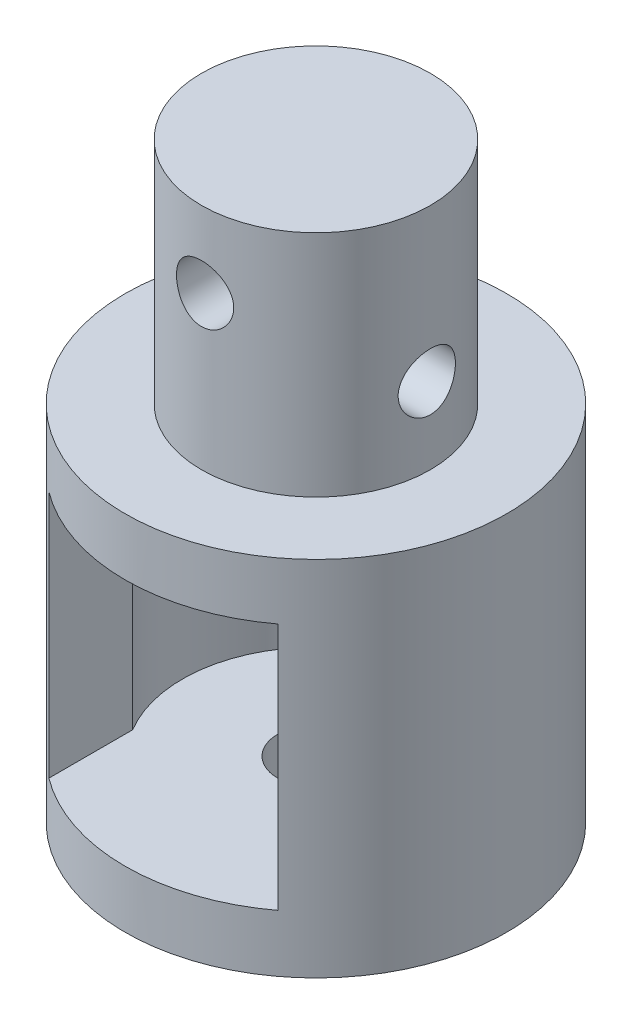
ISO-10303-21;
HEADER;
FILE_DESCRIPTION(('STEP AP214'),'2;1');
FILE_NAME('part.step','',(''),(''),'','','');
FILE_SCHEMA(('AUTOMOTIVE_DESIGN { 1 0 10303 214 1 1 1 1 }'));
ENDSEC;
DATA;
#1=APPLICATION_CONTEXT('core data for automotive mechanical design processes');
#2=APPLICATION_PROTOCOL_DEFINITION('international standard','automotive_design',2000,#1);
#3=PRODUCT_CONTEXT('',#1,'mechanical');
#4=PRODUCT('Part','Part','',(#3));
#5=PRODUCT_RELATED_PRODUCT_CATEGORY('part','',(#4));
#6=PRODUCT_DEFINITION_FORMATION('','',#4);
#7=PRODUCT_DEFINITION_CONTEXT('part definition',#1,'design');
#8=PRODUCT_DEFINITION('design','',#6,#7);
#9=PRODUCT_DEFINITION_SHAPE('','',#8);
#10=(LENGTH_UNIT() NAMED_UNIT(*) SI_UNIT(.MILLI.,.METRE.));
#11=(NAMED_UNIT(*) PLANE_ANGLE_UNIT() SI_UNIT($,.RADIAN.));
#12=(NAMED_UNIT(*) SI_UNIT($,.STERADIAN.) SOLID_ANGLE_UNIT());
#13=UNCERTAINTY_MEASURE_WITH_UNIT(LENGTH_MEASURE(1.E-05),#10,'distance_accuracy_value','');
#14=(GEOMETRIC_REPRESENTATION_CONTEXT(3) GLOBAL_UNCERTAINTY_ASSIGNED_CONTEXT((#13)) GLOBAL_UNIT_ASSIGNED_CONTEXT((#10,
#11,#12)) REPRESENTATION_CONTEXT('',''));
#15=CARTESIAN_POINT('',(0.,0.,0.));
#16=DIRECTION('',(0.,0.,1.));
#17=DIRECTION('',(1.,0.,0.));
#18=AXIS2_PLACEMENT_3D('',#15,#16,#17);
#19=CARTESIAN_POINT('',(0.,16.,0.));
#20=DIRECTION('',(0.,-1.,0.));
#21=DIRECTION('',(0.,0.,-1.));
#22=AXIS2_PLACEMENT_3D('',#19,#20,#21);
#23=CYLINDRICAL_SURFACE('',#22,7.);
#24=CARTESIAN_POINT('',(0.,3.,0.));
#25=DIRECTION('',(0.,1.,0.));
#26=DIRECTION('',(0.,0.,1.));
#27=AXIS2_PLACEMENT_3D('',#24,#25,#26);
#28=CIRCLE('',#27,7.);
#29=CARTESIAN_POINT('',(6.,3.,3.60555127546399));
#30=VERTEX_POINT('',#29);
#31=CARTESIAN_POINT('',(-6.,3.,3.60555127546399));
#32=VERTEX_POINT('',#31);
#33=EDGE_CURVE('E99',#30,#32,#28,.T.);
#34=ORIENTED_EDGE('',*,*,#33,.F.);
#35=DIRECTION('',(0.,-1.,0.));
#36=VECTOR('',#35,1.);
#37=CARTESIAN_POINT('',(6.,16.,3.60555127546399));
#38=LINE('',#37,#36);
#39=CARTESIAN_POINT('',(6.,16.,3.60555127546399));
#40=VERTEX_POINT('',#39);
#41=EDGE_CURVE('E89',#30,#40,#38,.F.);
#42=ORIENTED_EDGE('',*,*,#41,.T.);
#43=CARTESIAN_POINT('',(0.,16.,0.));
#44=DIRECTION('',(0.,1.,0.));
#45=DIRECTION('',(0.,0.,1.));
#46=AXIS2_PLACEMENT_3D('',#43,#44,#45);
#47=CIRCLE('',#46,7.);
#48=CARTESIAN_POINT('',(-6.,16.,3.60555127546399));
#49=VERTEX_POINT('',#48);
#50=EDGE_CURVE('E107',#40,#49,#47,.T.);
#51=ORIENTED_EDGE('',*,*,#50,.T.);
#52=DIRECTION('',(0.,-1.,0.));
#53=VECTOR('',#52,1.);
#54=CARTESIAN_POINT('',(-6.,16.,3.60555127546399));
#55=LINE('',#54,#53);
#56=EDGE_CURVE('E90',#49,#32,#55,.T.);
#57=ORIENTED_EDGE('',*,*,#56,.T.);
#58=EDGE_LOOP('',(#34,#42,#51,#57));
#59=FACE_BOUND('',#58,.T.);
#60=ADVANCED_FACE('F39',(#59),#23,.F.);
#61=CARTESIAN_POINT('',(0.,16.,0.));
#62=DIRECTION('',(0.,1.,0.));
#63=DIRECTION('',(0.,0.,1.));
#64=AXIS2_PLACEMENT_3D('',#61,#62,#63);
#65=PLANE('',#64);
#66=ORIENTED_EDGE('',*,*,#50,.F.);
#67=DIRECTION('',(0.,0.,-1.));
#68=VECTOR('',#67,1.);
#69=CARTESIAN_POINT('',(6.,16.,18.));
#70=LINE('',#69,#68);
#71=CARTESIAN_POINT('',(6.,16.,8.));
#72=VERTEX_POINT('',#71);
#73=EDGE_CURVE('E198',#72,#40,#70,.T.);
#74=ORIENTED_EDGE('',*,*,#73,.F.);
#75=CARTESIAN_POINT('',(0.,16.,0.));
#76=DIRECTION('',(0.,-1.,0.));
#77=DIRECTION('',(0.,0.,-1.));
#78=AXIS2_PLACEMENT_3D('',#75,#76,#77);
#79=CIRCLE('',#78,10.);
#80=CARTESIAN_POINT('',(-6.,16.,8.));
#81=VERTEX_POINT('',#80);
#82=EDGE_CURVE('E105',#72,#81,#79,.T.);
#83=ORIENTED_EDGE('',*,*,#82,.T.);
#84=DIRECTION('',(0.,0.,-1.));
#85=VECTOR('',#84,1.);
#86=CARTESIAN_POINT('',(-6.,16.,18.));
#87=LINE('',#86,#85);
#88=EDGE_CURVE('E61',#81,#49,#87,.T.);
#89=ORIENTED_EDGE('',*,*,#88,.T.);
#90=EDGE_LOOP('',(#66,#74,#83,#89));
#91=FACE_BOUND('',#90,.T.);
#92=ADVANCED_FACE('F152',(#91),#65,.F.);
#93=CARTESIAN_POINT('',(0.,3.,0.));
#94=DIRECTION('',(0.,1.,0.));
#95=DIRECTION('',(0.,0.,1.));
#96=AXIS2_PLACEMENT_3D('',#93,#94,#95);
#97=PLANE('',#96);
#98=CARTESIAN_POINT('',(0.,3.,0.));
#99=DIRECTION('',(0.,1.,0.));
#100=DIRECTION('',(0.,0.,1.));
#101=AXIS2_PLACEMENT_3D('',#98,#99,#100);
#102=CIRCLE('',#101,2.);
#103=CARTESIAN_POINT('',(0.,3.,2.));
#104=VERTEX_POINT('',#103);
#105=EDGE_CURVE('E129',#104,#104,#102,.T.);
#106=ORIENTED_EDGE('',*,*,#105,.F.);
#107=EDGE_LOOP('',(#106));
#108=FACE_BOUND('',#107,.T.);
#109=ORIENTED_EDGE('',*,*,#33,.T.);
#110=DIRECTION('',(0.,0.,-1.));
#111=VECTOR('',#110,1.);
#112=CARTESIAN_POINT('',(-6.,3.,18.));
#113=LINE('',#112,#111);
#114=CARTESIAN_POINT('',(-6.,3.,8.));
#115=VERTEX_POINT('',#114);
#116=EDGE_CURVE('E66',#115,#32,#113,.T.);
#117=ORIENTED_EDGE('',*,*,#116,.F.);
#118=CARTESIAN_POINT('',(0.,3.,0.));
#119=DIRECTION('',(0.,1.,0.));
#120=DIRECTION('',(0.,0.,1.));
#121=AXIS2_PLACEMENT_3D('',#118,#119,#120);
#122=CIRCLE('',#121,10.);
#123=CARTESIAN_POINT('',(6.,3.,8.));
#124=VERTEX_POINT('',#123);
#125=EDGE_CURVE('E96',#115,#124,#122,.T.);
#126=ORIENTED_EDGE('',*,*,#125,.T.);
#127=DIRECTION('',(0.,0.,-1.));
#128=VECTOR('',#127,1.);
#129=CARTESIAN_POINT('',(6.,3.,18.));
#130=LINE('',#129,#128);
#131=EDGE_CURVE('E200',#124,#30,#130,.T.);
#132=ORIENTED_EDGE('',*,*,#131,.T.);
#133=EDGE_LOOP('',(#109,#117,#126,#132));
#134=FACE_BOUND('',#133,.T.);
#135=ADVANCED_FACE('F94',(#108,#134),#97,.T.);
#136=CARTESIAN_POINT('',(6.,3.,18.));
#137=DIRECTION('',(-1.,0.,0.));
#138=DIRECTION('',(0.,0.,1.));
#139=AXIS2_PLACEMENT_3D('',#136,#137,#138);
#140=PLANE('',#139);
#141=DIRECTION('',(0.,1.,0.));
#142=VECTOR('',#141,1.);
#143=CARTESIAN_POINT('',(6.,31.,8.));
#144=LINE('',#143,#142);
#145=EDGE_CURVE('E104',#124,#72,#144,.T.);
#146=ORIENTED_EDGE('',*,*,#145,.T.);
#147=ORIENTED_EDGE('',*,*,#73,.T.);
#148=ORIENTED_EDGE('',*,*,#41,.F.);
#149=ORIENTED_EDGE('',*,*,#131,.F.);
#150=EDGE_LOOP('',(#146,#147,#148,#149));
#151=FACE_BOUND('',#150,.T.);
#152=ADVANCED_FACE('F148',(#151),#140,.T.);
#153=CARTESIAN_POINT('',(-6.,16.,18.));
#154=DIRECTION('',(1.,0.,0.));
#155=DIRECTION('',(0.,0.,-1.));
#156=AXIS2_PLACEMENT_3D('',#153,#154,#155);
#157=PLANE('',#156);
#158=DIRECTION('',(0.,1.,0.));
#159=VECTOR('',#158,1.);
#160=CARTESIAN_POINT('',(-6.,31.,8.));
#161=LINE('',#160,#159);
#162=EDGE_CURVE('E84',#81,#115,#161,.F.);
#163=ORIENTED_EDGE('',*,*,#162,.T.);
#164=ORIENTED_EDGE('',*,*,#116,.T.);
#165=ORIENTED_EDGE('',*,*,#56,.F.);
#166=ORIENTED_EDGE('',*,*,#88,.F.);
#167=EDGE_LOOP('',(#163,#164,#165,#166));
#168=FACE_BOUND('',#167,.T.);
#169=ADVANCED_FACE('F85',(#168),#157,.T.);
#170=CARTESIAN_POINT('',(0.,31.,0.));
#171=DIRECTION('',(0.,1.,0.));
#172=DIRECTION('',(-1.,0.,0.));
#173=AXIS2_PLACEMENT_3D('',#170,#171,#172);
#174=CYLINDRICAL_SURFACE('',#173,10.);
#175=CARTESIAN_POINT('',(0.,0.,0.));
#176=DIRECTION('',(0.,1.,0.));
#177=DIRECTION('',(-1.,0.,0.));
#178=AXIS2_PLACEMENT_3D('',#175,#176,#177);
#179=CIRCLE('',#178,10.);
#180=CARTESIAN_POINT('',(-10.,0.,0.));
#181=VERTEX_POINT('',#180);
#182=EDGE_CURVE('E11',#181,#181,#179,.T.);
#183=ORIENTED_EDGE('',*,*,#182,.T.);
#184=EDGE_LOOP('',(#183));
#185=FACE_BOUND('',#184,.T.);
#186=CARTESIAN_POINT('',(0.,19.,0.));
#187=DIRECTION('',(0.,1.,0.));
#188=DIRECTION('',(-1.,0.,0.));
#189=AXIS2_PLACEMENT_3D('',#186,#187,#188);
#190=CIRCLE('',#189,10.);
#191=CARTESIAN_POINT('',(-10.,19.,0.));
#192=VERTEX_POINT('',#191);
#193=EDGE_CURVE('E53',#192,#192,#190,.T.);
#194=ORIENTED_EDGE('',*,*,#193,.F.);
#195=EDGE_LOOP('',(#194));
#196=FACE_BOUND('',#195,.T.);
#197=ORIENTED_EDGE('',*,*,#125,.F.);
#198=ORIENTED_EDGE('',*,*,#162,.F.);
#199=ORIENTED_EDGE('',*,*,#82,.F.);
#200=ORIENTED_EDGE('',*,*,#145,.F.);
#201=EDGE_LOOP('',(#197,#198,#199,#200));
#202=FACE_BOUND('',#201,.T.);
#203=ADVANCED_FACE('F103',(#185,#196,#202),#174,.T.);
#204=CARTESIAN_POINT('',(0.,0.,0.));
#205=DIRECTION('',(0.,1.,0.));
#206=DIRECTION('',(-1.,0.,0.));
#207=AXIS2_PLACEMENT_3D('',#204,#205,#206);
#208=PLANE('',#207);
#209=CARTESIAN_POINT('',(0.,0.,0.));
#210=DIRECTION('',(0.,-1.,0.));
#211=DIRECTION('',(0.,0.,-1.));
#212=AXIS2_PLACEMENT_3D('',#209,#210,#211);
#213=CIRCLE('',#212,2.);
#214=CARTESIAN_POINT('',(0.,0.,-2.));
#215=VERTEX_POINT('',#214);
#216=EDGE_CURVE('E189',#215,#215,#213,.T.);
#217=ORIENTED_EDGE('',*,*,#216,.F.);
#218=EDGE_LOOP('',(#217));
#219=FACE_BOUND('',#218,.T.);
#220=ORIENTED_EDGE('',*,*,#182,.F.);
#221=EDGE_LOOP('',(#220));
#222=FACE_BOUND('',#221,.T.);
#223=ADVANCED_FACE('F41',(#219,#222),#208,.F.);
#224=CARTESIAN_POINT('',(10.,19.,0.));
#225=DIRECTION('',(0.,-1.,0.));
#226=DIRECTION('',(1.,0.,0.));
#227=AXIS2_PLACEMENT_3D('',#224,#225,#226);
#228=PLANE('',#227);
#229=CARTESIAN_POINT('',(0.,19.,0.));
#230=DIRECTION('',(0.,1.,0.));
#231=DIRECTION('',(-1.,0.,0.));
#232=AXIS2_PLACEMENT_3D('',#229,#230,#231);
#233=CIRCLE('',#232,6.);
#234=CARTESIAN_POINT('',(-6.,19.,0.));
#235=VERTEX_POINT('',#234);
#236=EDGE_CURVE('E117',#235,#235,#233,.T.);
#237=ORIENTED_EDGE('',*,*,#236,.F.);
#238=EDGE_LOOP('',(#237));
#239=FACE_BOUND('',#238,.T.);
#240=ORIENTED_EDGE('',*,*,#193,.T.);
#241=EDGE_LOOP('',(#240));
#242=FACE_BOUND('',#241,.T.);
#243=ADVANCED_FACE('F166',(#239,#242),#228,.F.);
#244=CARTESIAN_POINT('',(0.,31.,0.));
#245=DIRECTION('',(0.,1.,0.));
#246=DIRECTION('',(-1.,0.,0.));
#247=AXIS2_PLACEMENT_3D('',#244,#245,#246);
#248=CYLINDRICAL_SURFACE('',#247,6.);
#249=CARTESIAN_POINT('',(-6.,21.5,0.));
#250=CARTESIAN_POINT('',(-5.99999859868012,21.5000023257382,-0.0828760886697311));
#251=CARTESIAN_POINT('',(-5.99826578131828,21.5068915507738,-0.165778157830763));
#252=CARTESIAN_POINT('',(-5.99152113829892,21.534225151307,-0.329206323770533));
#253=CARTESIAN_POINT('',(-5.98650745419968,21.5546772095378,-0.409731046870739));
#254=CARTESIAN_POINT('',(-5.9737562633204,21.6084392534621,-0.566020872182577));
#255=CARTESIAN_POINT('',(-5.96602202842087,21.6417337987153,-0.641791563430003));
#256=CARTESIAN_POINT('',(-5.94865343807593,21.7201813900448,-0.786672131904427));
#257=CARTESIAN_POINT('',(-5.9390190185405,21.7653348361189,-0.85578178434876));
#258=CARTESIAN_POINT('',(-5.91867413591801,21.8672007896542,-0.986801927300921));
#259=CARTESIAN_POINT('',(-5.90794707148533,21.9241115749592,-1.04855569006107));
#260=CARTESIAN_POINT('',(-5.88673620117529,22.0474522049089,-1.16174892720331));
#261=CARTESIAN_POINT('',(-5.87625242288348,22.1138831229465,-1.21318723694914));
#262=CARTESIAN_POINT('',(-5.8565477569971,22.2555952267374,-1.30502654279903));
#263=CARTESIAN_POINT('',(-5.84734794470605,22.3309932308104,-1.34525221592536));
#264=CARTESIAN_POINT('',(-5.83149494812223,22.4877484116584,-1.41239690855053));
#265=CARTESIAN_POINT('',(-5.82484135672789,22.5691046333258,-1.43931805543933));
#266=CARTESIAN_POINT('',(-5.81500476717551,22.7337434982025,-1.47855483680429));
#267=CARTESIAN_POINT('',(-5.81175491075426,22.8169548960498,-1.49115226833334));
#268=CARTESIAN_POINT('',(-5.80889362537741,22.984368569014,-1.50226177506785));
#269=CARTESIAN_POINT('',(-5.80928160448644,23.0685706806986,-1.50077614181798));
#270=CARTESIAN_POINT('',(-5.81359205496618,23.2334158077445,-1.48398652463928));
#271=CARTESIAN_POINT('',(-5.81742863001879,23.3140956214651,-1.46901834019052));
#272=CARTESIAN_POINT('',(-5.82806709676483,23.4717610509113,-1.42622418690311));
#273=CARTESIAN_POINT('',(-5.83486919970696,23.548746403029,-1.39839730206942));
#274=CARTESIAN_POINT('',(-5.85075113904186,23.6977380162521,-1.33038947793716));
#275=CARTESIAN_POINT('',(-5.85985327469421,23.7696861717896,-1.29008666723291));
#276=CARTESIAN_POINT('',(-5.87929710846386,23.9059187097568,-1.19835627601496));
#277=CARTESIAN_POINT('',(-5.88963902334735,23.9702017480673,-1.14692674880884));
#278=CARTESIAN_POINT('',(-5.91075880539781,24.0912036156944,-1.03266342468122));
#279=CARTESIAN_POINT('',(-5.92154069477971,24.1476544900613,-0.969546258165861));
#280=CARTESIAN_POINT('',(-5.94205965578785,24.2492212424639,-0.834611917503702));
#281=CARTESIAN_POINT('',(-5.95179669549415,24.2943367742636,-0.762794477707947));
#282=CARTESIAN_POINT('',(-5.96917732094182,24.3720505862244,-0.612115888681395));
#283=CARTESIAN_POINT('',(-5.97681360127725,24.4046053402544,-0.533231393208626));
#284=CARTESIAN_POINT('',(-5.98907916991418,24.4559173057096,-0.370876008142885));
#285=CARTESIAN_POINT('',(-5.99370903339281,24.4746771564181,-0.287405999150486));
#286=CARTESIAN_POINT('',(-5.99935499271374,24.4974575655588,-0.120539970390027));
#287=CARTESIAN_POINT('',(-6.00046053508278,24.5018430260753,-0.0371967199882093));
#288=CARTESIAN_POINT('',(-5.99918804814451,24.4967509979445,0.129032874801509));
#289=CARTESIAN_POINT('',(-5.99681033241846,24.4872747572009,0.211919259644596));
#290=CARTESIAN_POINT('',(-5.98889581127357,24.4550290916086,0.373614268776492));
#291=CARTESIAN_POINT('',(-5.98340634185811,24.432458736523,0.452465118968754));
#292=CARTESIAN_POINT('',(-5.96988706634134,24.3748929159716,0.605257292452511));
#293=CARTESIAN_POINT('',(-5.96185700369892,24.3398961956868,0.679198119032635));
#294=CARTESIAN_POINT('',(-5.9439330792631,24.2577638711253,0.821523134429849));
#295=CARTESIAN_POINT('',(-5.93400867366932,24.2104238876032,0.889785441835833));
#296=CARTESIAN_POINT('',(-5.91344509187419,24.105210091203,1.01752661364325));
#297=CARTESIAN_POINT('',(-5.90280579251704,24.0473344603831,1.07700395897301));
#298=CARTESIAN_POINT('',(-5.88168956960771,23.9209980391555,1.18699056807273));
#299=CARTESIAN_POINT('',(-5.87122304187281,23.8523122969976,1.23724386762203));
#300=CARTESIAN_POINT('',(-5.85192878377238,23.7072673655343,1.3255107590127));
#301=CARTESIAN_POINT('',(-5.84310098067026,23.6309085170402,1.36352489415794));
#302=CARTESIAN_POINT('',(-5.82818094734665,23.4730942775869,1.42595142060929));
#303=CARTESIAN_POINT('',(-5.82207255291905,23.391672371656,1.45044439665407));
#304=CARTESIAN_POINT('',(-5.81326744090183,23.2256903621109,1.48534565995378));
#305=CARTESIAN_POINT('',(-5.81056997719936,23.1411309489675,1.49575702747866));
#306=CARTESIAN_POINT('',(-5.80894901203957,22.9738789761448,1.502038590334));
#307=CARTESIAN_POINT('',(-5.80991932728263,22.8912025648753,1.49831789778012));
#308=CARTESIAN_POINT('',(-5.81527909007842,22.727696111332,1.47737727831287));
#309=CARTESIAN_POINT('',(-5.81966846891857,22.6468660319863,1.46015762268677));
#310=CARTESIAN_POINT('',(-5.83131260682722,22.4897915409346,1.4129313194428));
#311=CARTESIAN_POINT('',(-5.83855015236309,22.4135226947598,1.38300140468038));
#312=CARTESIAN_POINT('',(-5.85507755724828,22.2670346172863,1.31126491360507));
#313=CARTESIAN_POINT('',(-5.86436770120773,22.1968162268131,1.26945669003419));
#314=CARTESIAN_POINT('',(-5.88425634263512,22.062445370998,1.17386774863714));
#315=CARTESIAN_POINT('',(-5.89488264831757,21.998498926576,1.11980316291226));
#316=CARTESIAN_POINT('',(-5.91608027246285,21.8804529552046,1.00178937118974));
#317=CARTESIAN_POINT('',(-5.92665157727059,21.826355769887,0.937837821261147));
#318=CARTESIAN_POINT('',(-5.94677655647663,21.7285886914354,0.800467586702591));
#319=CARTESIAN_POINT('',(-5.95630833365868,21.6851253863284,0.726898422316388));
#320=CARTESIAN_POINT('',(-5.97304924975118,21.6112525370595,0.573266059510477));
#321=CARTESIAN_POINT('',(-5.98026005199781,21.5808336393515,0.49320756343674));
#322=CARTESIAN_POINT('',(-5.99048059565541,21.5384281696703,0.344410253243472));
#323=CARTESIAN_POINT('',(-5.9940258505269,21.5240487569466,0.276380170908069));
#324=CARTESIAN_POINT('',(-5.99878605231948,21.5048340563781,0.138906071536283));
#325=CARTESIAN_POINT('',(-6.00000117450894,21.4999980506947,0.0694621612426163));
#326=CARTESIAN_POINT('',(-6.,21.5,0.));
#327=B_SPLINE_CURVE_WITH_KNOTS('',3,(#249,#250,#251,#252,#253,#254,#255,#256,#257,#258,#259,
#260,#261,#262,#263,#264,#265,#266,#267,#268,#269,#270,#271,#272,#273,#274,#275,#276,#277,#278,
#279,#280,#281,#282,#283,#284,#285,#286,#287,#288,#289,#290,#291,#292,#293,#294,#295,#296,#297,
#298,#299,#300,#301,#302,#303,#304,#305,#306,#307,#308,#309,#310,#311,#312,#313,#314,#315,#316,
#317,#318,#319,#320,#321,#322,#323,#324,#325,#326),.UNSPECIFIED.,.T.,.F.,(4,2,2,2,2,2,2,2,2,2,2,
2,2,2,2,2,2,2,2,2,2,2,2,2,2,2,2,2,2,2,2,2,2,2,2,2,2,2,4),(0.,0.24837371247189,0.4968882377639,
0.745104902286105,0.99332994016933,1.24614435437139,1.49898729580062,1.75558647545807,
2.01214461169369,2.26356295099431,2.51494038112697,2.76022497007018,3.00552703466039,
3.2533052787388,3.50112690836163,3.75601500969019,4.01091089558247,4.26668229009114,
4.52240473688643,4.77158308949277,5.02073901112743,5.26620274514038,5.51169127322291,
5.76153587565353,6.0114236300802,6.26744509204476,6.52345518749508,6.77792254614037,
7.03233423252408,7.27943780398613,7.52653640956035,7.77216400559448,8.01782568136901,
8.2698957640991,8.52202569770418,8.77872185499588,9.03523363821351,9.2434224294215,
9.4515955604304),.UNSPECIFIED.);
#328=CARTESIAN_POINT('',(-6.,21.5,0.));
#329=VERTEX_POINT('',#328);
#330=EDGE_CURVE('E43',#329,#329,#327,.T.);
#331=ORIENTED_EDGE('',*,*,#330,.T.);
#332=EDGE_LOOP('',(#331));
#333=FACE_BOUND('',#332,.T.);
#334=CARTESIAN_POINT('',(5.80947501931112,23.,-1.5));
#335=CARTESIAN_POINT('',(5.80947660051185,22.9171695494452,-1.49999764715507));
#336=CARTESIAN_POINT('',(5.81126583608348,22.8343130607932,-1.49311574729838));
#337=CARTESIAN_POINT('',(5.81821117195949,22.6709794530956,-1.46581387527849));
#338=CARTESIAN_POINT('',(5.82336923173088,22.590503747319,-1.44538602404532));
#339=CARTESIAN_POINT('',(5.8364323475758,22.4343178770878,-1.39169471977917));
#340=CARTESIAN_POINT('',(5.84433385614245,22.3586017067686,-1.35844783671268));
#341=CARTESIAN_POINT('',(5.86198915217285,22.213813488476,-1.28011268475685));
#342=CARTESIAN_POINT('',(5.87174301827101,22.1447417227519,-1.23502391313642));
#343=CARTESIAN_POINT('',(5.89224429813367,22.0136830128427,-1.13322505638713));
#344=CARTESIAN_POINT('',(5.90300758573818,21.95186383979,-1.07630213262243));
#345=CARTESIAN_POINT('',(5.92417725309178,21.8385431633838,-0.952909238460403));
#346=CARTESIAN_POINT('',(5.93458359939834,21.787042624627,-0.886438376508188));
#347=CARTESIAN_POINT('',(5.95404249312349,21.6951347194212,-0.744687120647377));
#348=CARTESIAN_POINT('',(5.96307412440355,21.6548921671031,-0.669296745717076));
#349=CARTESIAN_POINT('',(5.9785848715559,21.5877142135081,-0.51255791057566));
#350=CARTESIAN_POINT('',(5.98506436400607,21.5607768488507,-0.431210331475166));
#351=CARTESIAN_POINT('',(5.99462855308908,21.5215112992528,-0.266615255252498));
#352=CARTESIAN_POINT('',(5.99777936306589,21.508898213404,-0.183439631729386));
#353=CARTESIAN_POINT('',(6.00056156464379,21.4977449724347,-0.016097291557662));
#354=CARTESIAN_POINT('',(6.00019347658022,21.4992027366742,0.0680692767228407));
#355=CARTESIAN_POINT('',(5.99602856972121,21.5159449101501,0.233028370758581));
#356=CARTESIAN_POINT('',(5.99230801404524,21.5309217950323,0.3138543234016));
#357=CARTESIAN_POINT('',(5.98194501914912,21.5737827620291,0.471807371120529));
#358=CARTESIAN_POINT('',(5.97530242439065,21.6016675312264,0.548934269055657));
#359=CARTESIAN_POINT('',(5.95972505820537,21.6698015424122,0.69811005525271));
#360=CARTESIAN_POINT('',(5.95077011817032,21.7101602267971,0.770106764649757));
#361=CARTESIAN_POINT('',(5.93153942285789,21.8020134074698,0.906413433510733));
#362=CARTESIAN_POINT('',(5.92126343791494,21.8535098411364,0.970722052628258));
#363=CARTESIAN_POINT('',(5.90018228261712,21.9678252451894,1.09166105262744));
#364=CARTESIAN_POINT('',(5.88937031715551,22.0309129354087,1.1480365186128));
#365=CARTESIAN_POINT('',(5.86869026110024,22.1657599841242,1.24946456394453));
#366=CARTESIAN_POINT('',(5.85882221463582,22.2375197476946,1.29451661406903));
#367=CARTESIAN_POINT('',(5.84112298098989,22.3881740204894,1.3721821935339));
#368=CARTESIAN_POINT('',(5.83330190235432,22.4671014381879,1.40473435045574));
#369=CARTESIAN_POINT('',(5.82071184083974,22.6295512808459,1.45602843095451));
#370=CARTESIAN_POINT('',(5.81594220486131,22.7130727183899,1.47477330982937));
#371=CARTESIAN_POINT('',(5.81013213623484,22.8799757009139,1.49749778319911));
#372=CARTESIAN_POINT('',(5.80899653456189,22.9633026759978,1.50185428435178));
#373=CARTESIAN_POINT('',(5.81032406088624,23.1294931619469,1.49671019430933));
#374=CARTESIAN_POINT('',(5.8127868576076,23.2123567147707,1.48721087870928));
#375=CARTESIAN_POINT('',(5.82094249172736,23.3738685589728,1.4549552783626));
#376=CARTESIAN_POINT('',(5.82658182140625,23.4525636359425,1.43241844096905));
#377=CARTESIAN_POINT('',(5.84040430962577,23.605058874711,1.37497084900237));
#378=CARTESIAN_POINT('',(5.84858776949168,23.6788584554332,1.34005862862753));
#379=CARTESIAN_POINT('',(5.86677682255957,23.8210647667204,1.25806240076194));
#380=CARTESIAN_POINT('',(5.87681501163985,23.8893373040259,1.21075305230138));
#381=CARTESIAN_POINT('',(5.8975024984303,24.0171130176808,1.10559043940169));
#382=CARTESIAN_POINT('',(5.90815189637082,24.07661474999,1.04773544220816));
#383=CARTESIAN_POINT('',(5.92918441818964,24.1866866255426,0.921394081477092));
#384=CARTESIAN_POINT('',(5.93955421237101,24.2369960375293,0.852677928797392));
#385=CARTESIAN_POINT('',(5.95858329968241,24.3253615201707,0.707554024042015));
#386=CARTESIAN_POINT('',(5.96724268202376,24.3634182299649,0.631146673436389));
#387=CARTESIAN_POINT('',(5.98182069442988,24.4258676207168,0.473337302596637));
#388=CARTESIAN_POINT('',(5.98775898013446,24.4503585706274,0.391976071541823));
#389=CARTESIAN_POINT('',(5.99631176037473,24.485276200765,0.226124640478213));
#390=CARTESIAN_POINT('',(5.99892689636045,24.4957055952434,0.141635047561867));
#391=CARTESIAN_POINT('',(6.00051254113217,24.5020513843633,-0.0256252896649879));
#392=CARTESIAN_POINT('',(5.99957968320012,24.4983525636431,-0.108380740449048));
#393=CARTESIAN_POINT('',(5.99438844686135,24.4774282590585,-0.272051244622108));
#394=CARTESIAN_POINT('',(5.99013016735643,24.4602031774803,-0.352966352671329));
#395=CARTESIAN_POINT('',(5.97878149280944,24.4129216703436,-0.510256553467223));
#396=CARTESIAN_POINT('',(5.97170646753999,24.3829348200281,-0.586653741871527));
#397=CARTESIAN_POINT('',(5.95546933370076,24.311044131471,-0.733375579562201));
#398=CARTESIAN_POINT('',(5.94630696206604,24.2691387909957,-0.803699461897576));
#399=CARTESIAN_POINT('',(5.92660874521999,24.1734271490044,-0.938102892635849));
#400=CARTESIAN_POINT('',(5.91604525418417,24.1193597856389,-1.00199248245088));
#401=CARTESIAN_POINT('',(5.89485973579863,24.0013657220393,-1.11992253040688));
#402=CARTESIAN_POINT('',(5.88423769428834,23.9374365258531,-1.17396048760228));
#403=CARTESIAN_POINT('',(5.86391213790822,23.800097878698,-1.27164303971884));
#404=CARTESIAN_POINT('',(5.85422945594827,23.7265338148811,-1.31507492916982));
#405=CARTESIAN_POINT('',(5.83715933325924,23.572916765116,-1.3888903449235));
#406=CARTESIAN_POINT('',(5.82977022370054,23.4928685508399,-1.41928336463958));
#407=CARTESIAN_POINT('',(5.81927863109675,23.3441344822599,-1.46163379284816));
#408=CARTESIAN_POINT('',(5.8156299450082,23.2761602534242,-1.47598975589307));
#409=CARTESIAN_POINT('',(5.81072757878358,23.1387966965001,-1.4951734388599));
#410=CARTESIAN_POINT('',(5.80947369434945,23.0694074896324,-1.50000197155828));
#411=CARTESIAN_POINT('',(5.80947501931112,23.,-1.5));
#412=B_SPLINE_CURVE_WITH_KNOTS('',3,(#334,#335,#336,#337,#338,#339,#340,#341,#342,#343,#344,
#345,#346,#347,#348,#349,#350,#351,#352,#353,#354,#355,#356,#357,#358,#359,#360,#361,#362,#363,
#364,#365,#366,#367,#368,#369,#370,#371,#372,#373,#374,#375,#376,#377,#378,#379,#380,#381,#382,
#383,#384,#385,#386,#387,#388,#389,#390,#391,#392,#393,#394,#395,#396,#397,#398,#399,#400,#401,
#402,#403,#404,#405,#406,#407,#408,#409,#410,#411),.UNSPECIFIED.,.T.,.F.,(4,2,2,2,2,2,2,2,2,2,2,
2,2,2,2,2,2,2,2,2,2,2,2,2,2,2,2,2,2,2,2,2,2,2,2,2,2,2,4),(0.,0.248236465041684,
0.496617444857199,0.744678436299609,0.99274996053287,1.24574372515785,1.4987611288792,
1.75530897838752,2.01181895908256,2.26313250597208,2.51440889199612,2.76010957613368,
3.00582334034872,3.25375724552667,3.50173431281348,3.75642279943147,4.01112318719882,
4.26705859205042,4.52293920077729,4.77206144857031,5.02116076310281,5.26618443005524,
5.51123712852851,5.76109707515495,6.01099811331027,6.26715198579192,6.52329249431733,
6.77755243684158,7.03176329345423,7.27910067676475,7.52643070426189,7.77242925935827,
8.01845883442844,8.27038257949243,8.52237018939306,8.77905886370807,9.03556032819973,
9.24358696306399,9.45159585059714),.UNSPECIFIED.);
#413=CARTESIAN_POINT('',(5.80947501931112,23.,-1.5));
#414=VERTEX_POINT('',#413);
#415=EDGE_CURVE('E195',#414,#414,#412,.T.);
#416=ORIENTED_EDGE('',*,*,#415,.T.);
#417=EDGE_LOOP('',(#416));
#418=FACE_BOUND('',#417,.T.);
#419=CARTESIAN_POINT('',(1.5,27.,-5.80947501931112));
#420=CARTESIAN_POINT('',(1.49999764715507,27.0828304505548,-5.80947660051185));
#421=CARTESIAN_POINT('',(1.49311574729838,27.1656869392068,-5.81126583608348));
#422=CARTESIAN_POINT('',(1.46581387527849,27.3290205469044,-5.81821117195949));
#423=CARTESIAN_POINT('',(1.44538602404532,27.409496252681,-5.82336923173088));
#424=CARTESIAN_POINT('',(1.39169471977917,27.5656821229122,-5.8364323475758));
#425=CARTESIAN_POINT('',(1.35844783671268,27.6413982932314,-5.84433385614245));
#426=CARTESIAN_POINT('',(1.28011268475685,27.786186511524,-5.86198915217284));
#427=CARTESIAN_POINT('',(1.23502391313642,27.8552582772481,-5.87174301827101));
#428=CARTESIAN_POINT('',(1.13322505638713,27.9863169871573,-5.89224429813367));
#429=CARTESIAN_POINT('',(1.07630213262243,28.04813616021,-5.90300758573818));
#430=CARTESIAN_POINT('',(0.952909238460399,28.1614568366162,-5.92417725309178));
#431=CARTESIAN_POINT('',(0.886438376508185,28.212957375373,-5.93458359939834));
#432=CARTESIAN_POINT('',(0.744687120647373,28.3048652805788,-5.95404249312349));
#433=CARTESIAN_POINT('',(0.669296745717072,28.3451078328969,-5.96307412440355));
#434=CARTESIAN_POINT('',(0.512557910575657,28.4122857864919,-5.9785848715559));
#435=CARTESIAN_POINT('',(0.431210331475165,28.4392231511493,-5.98506436400607));
#436=CARTESIAN_POINT('',(0.266615255252498,28.4784887007472,-5.99462855308908));
#437=CARTESIAN_POINT('',(0.183439631729386,28.4911017865959,-5.99777936306588));
#438=CARTESIAN_POINT('',(0.0160972915576619,28.5022550275653,-6.00056156464379));
#439=CARTESIAN_POINT('',(-0.0680692767228408,28.5007972633258,-6.00019347658022));
#440=CARTESIAN_POINT('',(-0.233028370758581,28.4840550898499,-5.99602856972121));
#441=CARTESIAN_POINT('',(-0.313854323401601,28.4690782049677,-5.99230801404524));
#442=CARTESIAN_POINT('',(-0.471807371120529,28.4262172379709,-5.98194501914912));
#443=CARTESIAN_POINT('',(-0.548934269055657,28.3983324687736,-5.97530242439064));
#444=CARTESIAN_POINT('',(-0.69811005525271,28.3301984575878,-5.95972505820537));
#445=CARTESIAN_POINT('',(-0.770106764649757,28.2898397732029,-5.95077011817032));
#446=CARTESIAN_POINT('',(-0.906413433510733,28.1979865925302,-5.93153942285789));
#447=CARTESIAN_POINT('',(-0.970722052628258,28.1464901588636,-5.92126343791494));
#448=CARTESIAN_POINT('',(-1.09166105262744,28.0321747548106,-5.90018228261712));
#449=CARTESIAN_POINT('',(-1.1480365186128,27.9690870645913,-5.8893703171555));
#450=CARTESIAN_POINT('',(-1.24946456394453,27.8342400158758,-5.86869026110024));
#451=CARTESIAN_POINT('',(-1.29451661406903,27.7624802523054,-5.85882221463582));
#452=CARTESIAN_POINT('',(-1.3721821935339,27.6118259795106,-5.84112298098989));
#453=CARTESIAN_POINT('',(-1.40473435045574,27.5328985618121,-5.83330190235432));
#454=CARTESIAN_POINT('',(-1.45602843095451,27.3704487191541,-5.82071184083974));
#455=CARTESIAN_POINT('',(-1.47477330982937,27.2869272816101,-5.81594220486131));
#456=CARTESIAN_POINT('',(-1.49749778319911,27.1200242990861,-5.81013213623484));
#457=CARTESIAN_POINT('',(-1.50185428435178,27.0366973240022,-5.80899653456189));
#458=CARTESIAN_POINT('',(-1.49671019430933,26.8705068380531,-5.81032406088624));
#459=CARTESIAN_POINT('',(-1.48721087870928,26.7876432852293,-5.81278685760759));
#460=CARTESIAN_POINT('',(-1.4549552783626,26.6261314410272,-5.82094249172736));
#461=CARTESIAN_POINT('',(-1.43241844096905,26.5474363640575,-5.82658182140625));
#462=CARTESIAN_POINT('',(-1.37497084900237,26.394941125289,-5.84040430962577));
#463=CARTESIAN_POINT('',(-1.34005862862753,26.3211415445668,-5.84858776949168));
#464=CARTESIAN_POINT('',(-1.25806240076194,26.1789352332796,-5.86677682255957));
#465=CARTESIAN_POINT('',(-1.21075305230138,26.1106626959741,-5.87681501163985));
#466=CARTESIAN_POINT('',(-1.10559043940169,25.9828869823192,-5.89750249843029));
#467=CARTESIAN_POINT('',(-1.04773544220816,25.92338525001,-5.90815189637082));
#468=CARTESIAN_POINT('',(-0.921394081477092,25.8133133744574,-5.92918441818963));
#469=CARTESIAN_POINT('',(-0.852677928797392,25.7630039624707,-5.93955421237101));
#470=CARTESIAN_POINT('',(-0.707554024042015,25.6746384798293,-5.9585832996824));
#471=CARTESIAN_POINT('',(-0.631146673436389,25.6365817700351,-5.96724268202376));
#472=CARTESIAN_POINT('',(-0.473337302596637,25.5741323792832,-5.98182069442988));
#473=CARTESIAN_POINT('',(-0.391976071541823,25.5496414293726,-5.98775898013446));
#474=CARTESIAN_POINT('',(-0.226124640478212,25.514723799235,-5.99631176037473));
#475=CARTESIAN_POINT('',(-0.141635047561867,25.5042944047566,-5.99892689636045));
#476=CARTESIAN_POINT('',(0.0256252896649879,25.4979486156367,-6.00051254113217));
#477=CARTESIAN_POINT('',(0.108380740449049,25.5016474363569,-5.99957968320012));
#478=CARTESIAN_POINT('',(0.272051244622109,25.5225717409415,-5.99438844686135));
#479=CARTESIAN_POINT('',(0.352966352671329,25.5397968225196,-5.99013016735643));
#480=CARTESIAN_POINT('',(0.510256553467223,25.5870783296564,-5.97878149280944));
#481=CARTESIAN_POINT('',(0.586653741871528,25.6170651799719,-5.97170646753999));
#482=CARTESIAN_POINT('',(0.733375579562202,25.688955868529,-5.95546933370076));
#483=CARTESIAN_POINT('',(0.803699461897576,25.7308612090043,-5.94630696206604));
#484=CARTESIAN_POINT('',(0.938102892635848,25.8265728509956,-5.92660874521999));
#485=CARTESIAN_POINT('',(1.00199248245088,25.8806402143611,-5.91604525418417));
#486=CARTESIAN_POINT('',(1.11992253040688,25.9986342779607,-5.89485973579863));
#487=CARTESIAN_POINT('',(1.17396048760228,26.0625634741469,-5.88423769428834));
#488=CARTESIAN_POINT('',(1.27164303971884,26.199902121302,-5.86391213790822));
#489=CARTESIAN_POINT('',(1.31507492916982,26.2734661851189,-5.85422945594827));
#490=CARTESIAN_POINT('',(1.3888903449235,26.427083234884,-5.83715933325923));
#491=CARTESIAN_POINT('',(1.41928336463958,26.5071314491601,-5.82977022370054));
#492=CARTESIAN_POINT('',(1.46163379284816,26.6558655177401,-5.81927863109675));
#493=CARTESIAN_POINT('',(1.47598975589307,26.7238397465758,-5.8156299450082));
#494=CARTESIAN_POINT('',(1.4951734388599,26.8612033034999,-5.81072757878358));
#495=CARTESIAN_POINT('',(1.50000197155828,26.9305925103676,-5.80947369434945));
#496=CARTESIAN_POINT('',(1.5,27.,-5.80947501931112));
#497=B_SPLINE_CURVE_WITH_KNOTS('',3,(#419,#420,#421,#422,#423,#424,#425,#426,#427,#428,#429,
#430,#431,#432,#433,#434,#435,#436,#437,#438,#439,#440,#441,#442,#443,#444,#445,#446,#447,#448,
#449,#450,#451,#452,#453,#454,#455,#456,#457,#458,#459,#460,#461,#462,#463,#464,#465,#466,#467,
#468,#469,#470,#471,#472,#473,#474,#475,#476,#477,#478,#479,#480,#481,#482,#483,#484,#485,#486,
#487,#488,#489,#490,#491,#492,#493,#494,#495,#496),.UNSPECIFIED.,.T.,.F.,(4,2,2,2,2,2,2,2,2,2,2,
2,2,2,2,2,2,2,2,2,2,2,2,2,2,2,2,2,2,2,2,2,2,2,2,2,2,2,4),(0.,0.24823646504168,0.496617444857199,
0.744678436299612,0.99274996053287,1.24574372515786,1.4987611288792,1.75530897838752,
2.01181895908256,2.26313250597208,2.51440889199612,2.76010957613368,3.00582334034872,
3.25375724552667,3.50173431281348,3.75642279943147,4.01112318719882,4.26705859205041,
4.52293920077729,4.77206144857031,5.02116076310281,5.26618443005524,5.51123712852851,
5.76109707515495,6.01099811331027,6.26715198579192,6.52329249431733,6.77755243684158,
7.03176329345423,7.27910067676475,7.52643070426189,7.77242925935827,8.01845883442844,
8.27038257949243,8.52237018939306,8.77905886370807,9.03556032819973,9.24358696306399,
9.45159585059714),.UNSPECIFIED.);
#498=CARTESIAN_POINT('',(1.5,27.,-5.80947501931112));
#499=VERTEX_POINT('',#498);
#500=EDGE_CURVE('E100',#499,#499,#497,.T.);
#501=ORIENTED_EDGE('',*,*,#500,.T.);
#502=EDGE_LOOP('',(#501));
#503=FACE_BOUND('',#502,.T.);
#504=CARTESIAN_POINT('',(1.5,27.,5.80947501931112));
#505=CARTESIAN_POINT('',(1.49999764715507,26.9171695494452,5.80947660051185));
#506=CARTESIAN_POINT('',(1.49311574729838,26.8343130607932,5.81126583608348));
#507=CARTESIAN_POINT('',(1.46581387527849,26.6709794530956,5.81821117195949));
#508=CARTESIAN_POINT('',(1.44538602404532,26.590503747319,5.82336923173088));
#509=CARTESIAN_POINT('',(1.39169471977917,26.4343178770878,5.8364323475758));
#510=CARTESIAN_POINT('',(1.35844783671268,26.3586017067686,5.84433385614245));
#511=CARTESIAN_POINT('',(1.28011268475685,26.213813488476,5.86198915217285));
#512=CARTESIAN_POINT('',(1.23502391313642,26.1447417227519,5.87174301827101));
#513=CARTESIAN_POINT('',(1.13322505638713,26.0136830128427,5.89224429813367));
#514=CARTESIAN_POINT('',(1.07630213262243,25.95186383979,5.90300758573818));
#515=CARTESIAN_POINT('',(0.952909238460399,25.8385431633838,5.92417725309178));
#516=CARTESIAN_POINT('',(0.886438376508185,25.7870426246269,5.93458359939834));
#517=CARTESIAN_POINT('',(0.744687120647373,25.6951347194212,5.95404249312349));
#518=CARTESIAN_POINT('',(0.669296745717072,25.6548921671031,5.96307412440355));
#519=CARTESIAN_POINT('',(0.512557910575657,25.5877142135081,5.9785848715559));
#520=CARTESIAN_POINT('',(0.431210331475165,25.5607768488507,5.98506436400607));
#521=CARTESIAN_POINT('',(0.266615255252498,25.5215112992528,5.99462855308908));
#522=CARTESIAN_POINT('',(0.183439631729386,25.508898213404,5.99777936306588));
#523=CARTESIAN_POINT('',(0.0160972915576619,25.4977449724347,6.00056156464379));
#524=CARTESIAN_POINT('',(-0.0680692767228408,25.4992027366742,6.00019347658022));
#525=CARTESIAN_POINT('',(-0.233028370758581,25.5159449101501,5.99602856972121));
#526=CARTESIAN_POINT('',(-0.313854323401601,25.5309217950323,5.99230801404524));
#527=CARTESIAN_POINT('',(-0.471807371120529,25.5737827620291,5.98194501914912));
#528=CARTESIAN_POINT('',(-0.548934269055657,25.6016675312264,5.97530242439064));
#529=CARTESIAN_POINT('',(-0.69811005525271,25.6698015424122,5.95972505820537));
#530=CARTESIAN_POINT('',(-0.770106764649757,25.7101602267971,5.95077011817032));
#531=CARTESIAN_POINT('',(-0.906413433510733,25.8020134074698,5.93153942285789));
#532=CARTESIAN_POINT('',(-0.970722052628258,25.8535098411364,5.92126343791494));
#533=CARTESIAN_POINT('',(-1.09166105262743,25.9678252451894,5.90018228261712));
#534=CARTESIAN_POINT('',(-1.1480365186128,26.0309129354087,5.88937031715551));
#535=CARTESIAN_POINT('',(-1.24946456394453,26.1657599841242,5.86869026110024));
#536=CARTESIAN_POINT('',(-1.29451661406903,26.2375197476946,5.85882221463582));
#537=CARTESIAN_POINT('',(-1.3721821935339,26.3881740204894,5.84112298098989));
#538=CARTESIAN_POINT('',(-1.40473435045574,26.4671014381879,5.83330190235432));
#539=CARTESIAN_POINT('',(-1.45602843095451,26.6295512808459,5.82071184083974));
#540=CARTESIAN_POINT('',(-1.47477330982937,26.7130727183899,5.81594220486131));
#541=CARTESIAN_POINT('',(-1.49749778319911,26.8799757009139,5.81013213623484));
#542=CARTESIAN_POINT('',(-1.50185428435178,26.9633026759978,5.80899653456189));
#543=CARTESIAN_POINT('',(-1.49671019430933,27.1294931619469,5.81032406088624));
#544=CARTESIAN_POINT('',(-1.48721087870928,27.2123567147707,5.8127868576076));
#545=CARTESIAN_POINT('',(-1.4549552783626,27.3738685589728,5.82094249172736));
#546=CARTESIAN_POINT('',(-1.43241844096905,27.4525636359425,5.82658182140625));
#547=CARTESIAN_POINT('',(-1.37497084900237,27.605058874711,5.84040430962577));
#548=CARTESIAN_POINT('',(-1.34005862862753,27.6788584554332,5.84858776949168));
#549=CARTESIAN_POINT('',(-1.25806240076194,27.8210647667204,5.86677682255957));
#550=CARTESIAN_POINT('',(-1.21075305230138,27.8893373040259,5.87681501163985));
#551=CARTESIAN_POINT('',(-1.10559043940169,28.0171130176808,5.89750249843029));
#552=CARTESIAN_POINT('',(-1.04773544220816,28.07661474999,5.90815189637082));
#553=CARTESIAN_POINT('',(-0.921394081477092,28.1866866255426,5.92918441818964));
#554=CARTESIAN_POINT('',(-0.852677928797391,28.2369960375293,5.93955421237101));
#555=CARTESIAN_POINT('',(-0.707554024042014,28.3253615201707,5.9585832996824));
#556=CARTESIAN_POINT('',(-0.631146673436388,28.3634182299649,5.96724268202376));
#557=CARTESIAN_POINT('',(-0.473337302596637,28.4258676207168,5.98182069442988));
#558=CARTESIAN_POINT('',(-0.391976071541824,28.4503585706274,5.98775898013446));
#559=CARTESIAN_POINT('',(-0.226124640478213,28.485276200765,5.99631176037473));
#560=CARTESIAN_POINT('',(-0.141635047561867,28.4957055952434,5.99892689636045));
#561=CARTESIAN_POINT('',(0.0256252896649878,28.5020513843633,6.00051254113217));
#562=CARTESIAN_POINT('',(0.108380740449048,28.4983525636431,5.99957968320012));
#563=CARTESIAN_POINT('',(0.272051244622109,28.4774282590585,5.99438844686135));
#564=CARTESIAN_POINT('',(0.352966352671329,28.4602031774803,5.99013016735643));
#565=CARTESIAN_POINT('',(0.510256553467223,28.4129216703436,5.97878149280944));
#566=CARTESIAN_POINT('',(0.586653741871526,28.3829348200281,5.97170646753999));
#567=CARTESIAN_POINT('',(0.7333755795622,28.311044131471,5.95546933370076));
#568=CARTESIAN_POINT('',(0.803699461897576,28.2691387909957,5.94630696206604));
#569=CARTESIAN_POINT('',(0.938102892635848,28.1734271490044,5.92660874521999));
#570=CARTESIAN_POINT('',(1.00199248245088,28.1193597856389,5.91604525418417));
#571=CARTESIAN_POINT('',(1.11992253040688,28.0013657220393,5.89485973579863));
#572=CARTESIAN_POINT('',(1.17396048760228,27.9374365258531,5.88423769428834));
#573=CARTESIAN_POINT('',(1.27164303971884,27.800097878698,5.86391213790822));
#574=CARTESIAN_POINT('',(1.31507492916982,27.7265338148811,5.85422945594827));
#575=CARTESIAN_POINT('',(1.3888903449235,27.572916765116,5.83715933325923));
#576=CARTESIAN_POINT('',(1.41928336463958,27.4928685508399,5.82977022370054));
#577=CARTESIAN_POINT('',(1.46163379284816,27.3441344822599,5.81927863109675));
#578=CARTESIAN_POINT('',(1.47598975589307,27.2761602534242,5.8156299450082));
#579=CARTESIAN_POINT('',(1.4951734388599,27.1387966965001,5.81072757878358));
#580=CARTESIAN_POINT('',(1.50000197155828,27.0694074896324,5.80947369434945));
#581=CARTESIAN_POINT('',(1.5,27.,5.80947501931112));
#582=B_SPLINE_CURVE_WITH_KNOTS('',3,(#504,#505,#506,#507,#508,#509,#510,#511,#512,#513,#514,
#515,#516,#517,#518,#519,#520,#521,#522,#523,#524,#525,#526,#527,#528,#529,#530,#531,#532,#533,
#534,#535,#536,#537,#538,#539,#540,#541,#542,#543,#544,#545,#546,#547,#548,#549,#550,#551,#552,
#553,#554,#555,#556,#557,#558,#559,#560,#561,#562,#563,#564,#565,#566,#567,#568,#569,#570,#571,
#572,#573,#574,#575,#576,#577,#578,#579,#580,#581),.UNSPECIFIED.,.T.,.F.,(4,2,2,2,2,2,2,2,2,2,2,
2,2,2,2,2,2,2,2,2,2,2,2,2,2,2,2,2,2,2,2,2,2,2,2,2,2,2,4),(0.,0.24823646504168,0.496617444857199,
0.744678436299613,0.99274996053287,1.24574372515786,1.4987611288792,1.75530897838752,
2.01181895908256,2.26313250597208,2.51440889199612,2.76010957613368,3.00582334034872,
3.25375724552667,3.50173431281348,3.75642279943147,4.01112318719882,4.26705859205043,
4.52293920077729,4.77206144857031,5.02116076310281,5.26618443005524,5.51123712852851,
5.76109707515495,6.01099811331027,6.26715198579192,6.52329249431733,6.77755243684158,
7.03176329345423,7.27910067676475,7.52643070426189,7.77242925935827,8.01845883442844,
8.27038257949243,8.52237018939306,8.77905886370807,9.03556032819972,9.24358696306399,
9.45159585059713),.UNSPECIFIED.);
#583=CARTESIAN_POINT('',(1.5,27.,5.80947501931112));
#584=VERTEX_POINT('',#583);
#585=EDGE_CURVE('E122',#584,#584,#582,.T.);
#586=ORIENTED_EDGE('',*,*,#585,.T.);
#587=EDGE_LOOP('',(#586));
#588=FACE_BOUND('',#587,.T.);
#589=CARTESIAN_POINT('',(0.,31.,0.));
#590=DIRECTION('',(0.,1.,0.));
#591=DIRECTION('',(-1.,0.,0.));
#592=AXIS2_PLACEMENT_3D('',#589,#590,#591);
#593=CIRCLE('',#592,6.);
#594=CARTESIAN_POINT('',(-6.,31.,0.));
#595=VERTEX_POINT('',#594);
#596=EDGE_CURVE('E113',#595,#595,#593,.T.);
#597=ORIENTED_EDGE('',*,*,#596,.F.);
#598=EDGE_LOOP('',(#597));
#599=FACE_BOUND('',#598,.T.);
#600=ORIENTED_EDGE('',*,*,#236,.T.);
#601=EDGE_LOOP('',(#600));
#602=FACE_BOUND('',#601,.T.);
#603=ADVANCED_FACE('F133',(#333,#418,#503,#588,#599,#602),#248,.T.);
#604=CARTESIAN_POINT('',(6.,31.,0.));
#605=DIRECTION('',(0.,-1.,0.));
#606=DIRECTION('',(1.,0.,0.));
#607=AXIS2_PLACEMENT_3D('',#604,#605,#606);
#608=PLANE('',#607);
#609=ORIENTED_EDGE('',*,*,#596,.T.);
#610=EDGE_LOOP('',(#609));
#611=FACE_BOUND('',#610,.T.);
#612=ADVANCED_FACE('F143',(#611),#608,.F.);
#613=CARTESIAN_POINT('',(0.,27.,-10.));
#614=DIRECTION('',(0.,0.,1.));
#615=DIRECTION('',(1.,0.,0.));
#616=AXIS2_PLACEMENT_3D('',#613,#614,#615);
#617=CYLINDRICAL_SURFACE('',#616,1.5);
#618=ORIENTED_EDGE('',*,*,#585,.F.);
#619=EDGE_LOOP('',(#618));
#620=FACE_BOUND('',#619,.T.);
#621=ORIENTED_EDGE('',*,*,#500,.F.);
#622=EDGE_LOOP('',(#621));
#623=FACE_BOUND('',#622,.T.);
#624=ADVANCED_FACE('F137',(#620,#623),#617,.F.);
#625=CARTESIAN_POINT('',(0.,4.,0.));
#626=DIRECTION('',(0.,-1.,0.));
#627=DIRECTION('',(0.,0.,-1.));
#628=AXIS2_PLACEMENT_3D('',#625,#626,#627);
#629=CYLINDRICAL_SURFACE('',#628,2.);
#630=ORIENTED_EDGE('',*,*,#105,.T.);
#631=EDGE_LOOP('',(#630));
#632=FACE_BOUND('',#631,.T.);
#633=ORIENTED_EDGE('',*,*,#216,.T.);
#634=EDGE_LOOP('',(#633));
#635=FACE_BOUND('',#634,.T.);
#636=ADVANCED_FACE('F142',(#632,#635),#629,.F.);
#637=CARTESIAN_POINT('',(-10.,23.,0.));
#638=DIRECTION('',(1.,0.,0.));
#639=DIRECTION('',(0.,0.,-1.));
#640=AXIS2_PLACEMENT_3D('',#637,#638,#639);
#641=CYLINDRICAL_SURFACE('',#640,1.5);
#642=ORIENTED_EDGE('',*,*,#415,.F.);
#643=EDGE_LOOP('',(#642));
#644=FACE_BOUND('',#643,.T.);
#645=ORIENTED_EDGE('',*,*,#330,.F.);
#646=EDGE_LOOP('',(#645));
#647=FACE_BOUND('',#646,.T.);
#648=ADVANCED_FACE('F213',(#644,#647),#641,.F.);
#649=CLOSED_SHELL('',(#60,#92,#135,#152,#169,#203,#223,#243,#603,#612,#624,#636,#648));
#650=MANIFOLD_SOLID_BREP('B2',#649);
#651=ADVANCED_BREP_SHAPE_REPRESENTATION('',(#18,#650),#14);
#652=SHAPE_DEFINITION_REPRESENTATION(#9,#651);
ENDSEC;
END-ISO-10303-21;
